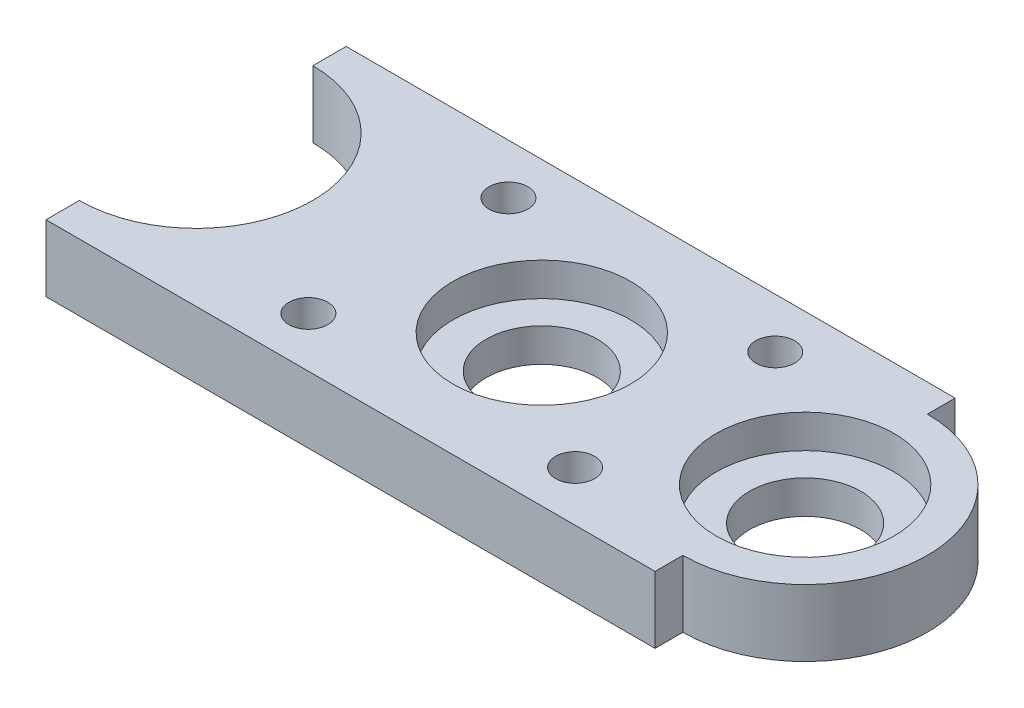
ISO-10303-21;
HEADER;
FILE_DESCRIPTION(('STEP AP214'),'2;1');
FILE_NAME('part.step','',(''),(''),'','','');
FILE_SCHEMA(('AUTOMOTIVE_DESIGN { 1 0 10303 214 1 1 1 1 }'));
ENDSEC;
DATA;
#1=APPLICATION_CONTEXT('core data for automotive mechanical design processes');
#2=APPLICATION_PROTOCOL_DEFINITION('international standard','automotive_design',2000,#1);
#3=PRODUCT_CONTEXT('',#1,'mechanical');
#4=PRODUCT('Part','Part','',(#3));
#5=PRODUCT_RELATED_PRODUCT_CATEGORY('part','',(#4));
#6=PRODUCT_DEFINITION_FORMATION('','',#4);
#7=PRODUCT_DEFINITION_CONTEXT('part definition',#1,'design');
#8=PRODUCT_DEFINITION('design','',#6,#7);
#9=PRODUCT_DEFINITION_SHAPE('','',#8);
#10=(LENGTH_UNIT() NAMED_UNIT(*) SI_UNIT(.MILLI.,.METRE.));
#11=(NAMED_UNIT(*) PLANE_ANGLE_UNIT() SI_UNIT($,.RADIAN.));
#12=(NAMED_UNIT(*) SI_UNIT($,.STERADIAN.) SOLID_ANGLE_UNIT());
#13=UNCERTAINTY_MEASURE_WITH_UNIT(LENGTH_MEASURE(1.E-05),#10,'distance_accuracy_value','');
#14=(GEOMETRIC_REPRESENTATION_CONTEXT(3) GLOBAL_UNCERTAINTY_ASSIGNED_CONTEXT((#13)) GLOBAL_UNIT_ASSIGNED_CONTEXT((#10,
#11,#12)) REPRESENTATION_CONTEXT('',''));
#15=CARTESIAN_POINT('',(0.,0.,0.));
#16=DIRECTION('',(0.,0.,1.));
#17=DIRECTION('',(1.,0.,0.));
#18=AXIS2_PLACEMENT_3D('',#15,#16,#17);
#19=CARTESIAN_POINT('',(0.,6.,0.));
#20=DIRECTION('',(0.,-1.,0.));
#21=DIRECTION('',(0.,0.,-1.));
#22=AXIS2_PLACEMENT_3D('',#19,#20,#21);
#23=CYLINDRICAL_SURFACE('',#22,5.);
#24=CARTESIAN_POINT('',(0.,0.,0.));
#25=DIRECTION('',(0.,1.,0.));
#26=DIRECTION('',(0.,0.,1.));
#27=AXIS2_PLACEMENT_3D('',#24,#25,#26);
#28=CIRCLE('',#27,5.);
#29=CARTESIAN_POINT('',(0.,0.,5.));
#30=VERTEX_POINT('',#29);
#31=EDGE_CURVE('E139',#30,#30,#28,.T.);
#32=ORIENTED_EDGE('',*,*,#31,.F.);
#33=EDGE_LOOP('',(#32));
#34=FACE_BOUND('',#33,.T.);
#35=CARTESIAN_POINT('',(0.,3.,0.));
#36=DIRECTION('',(0.,1.,0.));
#37=DIRECTION('',(0.,0.,1.));
#38=AXIS2_PLACEMENT_3D('',#35,#36,#37);
#39=CIRCLE('',#38,5.);
#40=CARTESIAN_POINT('',(0.,3.,5.));
#41=VERTEX_POINT('',#40);
#42=EDGE_CURVE('E490',#41,#41,#39,.T.);
#43=ORIENTED_EDGE('',*,*,#42,.T.);
#44=EDGE_LOOP('',(#43));
#45=FACE_BOUND('',#44,.T.);
#46=ADVANCED_FACE('F39',(#34,#45),#23,.F.);
#47=CARTESIAN_POINT('',(23.69,6.,0.));
#48=DIRECTION('',(0.,-1.,0.));
#49=DIRECTION('',(0.,0.,-1.));
#50=AXIS2_PLACEMENT_3D('',#47,#48,#49);
#51=CYLINDRICAL_SURFACE('',#50,5.);
#52=CARTESIAN_POINT('',(23.69,0.,0.));
#53=DIRECTION('',(0.,1.,0.));
#54=DIRECTION('',(0.,0.,1.));
#55=AXIS2_PLACEMENT_3D('',#52,#53,#54);
#56=CIRCLE('',#55,5.);
#57=CARTESIAN_POINT('',(23.69,0.,5.));
#58=VERTEX_POINT('',#57);
#59=EDGE_CURVE('E136',#58,#58,#56,.T.);
#60=ORIENTED_EDGE('',*,*,#59,.F.);
#61=EDGE_LOOP('',(#60));
#62=FACE_BOUND('',#61,.T.);
#63=CARTESIAN_POINT('',(23.69,3.,0.));
#64=DIRECTION('',(0.,1.,0.));
#65=DIRECTION('',(0.,0.,1.));
#66=AXIS2_PLACEMENT_3D('',#63,#64,#65);
#67=CIRCLE('',#66,5.);
#68=CARTESIAN_POINT('',(23.69,3.,5.));
#69=VERTEX_POINT('',#68);
#70=EDGE_CURVE('E499',#69,#69,#67,.T.);
#71=ORIENTED_EDGE('',*,*,#70,.T.);
#72=EDGE_LOOP('',(#71));
#73=FACE_BOUND('',#72,.T.);
#74=ADVANCED_FACE('F41',(#62,#73),#51,.F.);
#75=CARTESIAN_POINT('',(12.,6.,-9.));
#76=DIRECTION('',(0.,-1.,0.));
#77=DIRECTION('',(0.,0.,-1.));
#78=AXIS2_PLACEMENT_3D('',#75,#76,#77);
#79=CYLINDRICAL_SURFACE('',#78,1.75);
#80=CARTESIAN_POINT('',(12.,6.,-9.));
#81=DIRECTION('',(0.,1.,0.));
#82=DIRECTION('',(0.,0.,1.));
#83=AXIS2_PLACEMENT_3D('',#80,#81,#82);
#84=CIRCLE('',#83,1.75);
#85=CARTESIAN_POINT('',(12.,6.,-7.25));
#86=VERTEX_POINT('',#85);
#87=EDGE_CURVE('E265',#86,#86,#84,.T.);
#88=ORIENTED_EDGE('',*,*,#87,.T.);
#89=EDGE_LOOP('',(#88));
#90=FACE_BOUND('',#89,.T.);
#91=CARTESIAN_POINT('',(12.,3.,-9.));
#92=DIRECTION('',(0.,-1.,0.));
#93=DIRECTION('',(0.,0.,-1.));
#94=AXIS2_PLACEMENT_3D('',#91,#92,#93);
#95=CIRCLE('',#94,1.75);
#96=CARTESIAN_POINT('',(12.,3.,-10.75));
#97=VERTEX_POINT('',#96);
#98=EDGE_CURVE('E242',#97,#97,#95,.T.);
#99=ORIENTED_EDGE('',*,*,#98,.T.);
#100=EDGE_LOOP('',(#99));
#101=FACE_BOUND('',#100,.T.);
#102=ADVANCED_FACE('F199',(#90,#101),#79,.F.);
#103=CARTESIAN_POINT('',(12.,6.,9.));
#104=DIRECTION('',(0.,-1.,0.));
#105=DIRECTION('',(0.,0.,-1.));
#106=AXIS2_PLACEMENT_3D('',#103,#104,#105);
#107=CYLINDRICAL_SURFACE('',#106,1.75);
#108=CARTESIAN_POINT('',(12.,6.,9.));
#109=DIRECTION('',(0.,1.,0.));
#110=DIRECTION('',(0.,0.,1.));
#111=AXIS2_PLACEMENT_3D('',#108,#109,#110);
#112=CIRCLE('',#111,1.75);
#113=CARTESIAN_POINT('',(12.,6.,10.75));
#114=VERTEX_POINT('',#113);
#115=EDGE_CURVE('E262',#114,#114,#112,.T.);
#116=ORIENTED_EDGE('',*,*,#115,.T.);
#117=EDGE_LOOP('',(#116));
#118=FACE_BOUND('',#117,.T.);
#119=CARTESIAN_POINT('',(12.,3.,9.));
#120=DIRECTION('',(0.,-1.,0.));
#121=DIRECTION('',(0.,0.,-1.));
#122=AXIS2_PLACEMENT_3D('',#119,#120,#121);
#123=CIRCLE('',#122,1.75);
#124=CARTESIAN_POINT('',(12.,3.,7.25));
#125=VERTEX_POINT('',#124);
#126=EDGE_CURVE('E236',#125,#125,#123,.T.);
#127=ORIENTED_EDGE('',*,*,#126,.T.);
#128=EDGE_LOOP('',(#127));
#129=FACE_BOUND('',#128,.T.);
#130=ADVANCED_FACE('F204',(#118,#129),#107,.F.);
#131=CARTESIAN_POINT('',(-12.,6.,9.));
#132=DIRECTION('',(0.,-1.,0.));
#133=DIRECTION('',(0.,0.,-1.));
#134=AXIS2_PLACEMENT_3D('',#131,#132,#133);
#135=CYLINDRICAL_SURFACE('',#134,1.75);
#136=CARTESIAN_POINT('',(-12.,6.,9.));
#137=DIRECTION('',(0.,1.,0.));
#138=DIRECTION('',(0.,0.,1.));
#139=AXIS2_PLACEMENT_3D('',#136,#137,#138);
#140=CIRCLE('',#139,1.75);
#141=CARTESIAN_POINT('',(-12.,6.,10.75));
#142=VERTEX_POINT('',#141);
#143=EDGE_CURVE('E215',#142,#142,#140,.T.);
#144=ORIENTED_EDGE('',*,*,#143,.T.);
#145=EDGE_LOOP('',(#144));
#146=FACE_BOUND('',#145,.T.);
#147=CARTESIAN_POINT('',(-12.,3.,9.));
#148=DIRECTION('',(0.,-1.,0.));
#149=DIRECTION('',(0.,0.,-1.));
#150=AXIS2_PLACEMENT_3D('',#147,#148,#149);
#151=CIRCLE('',#150,1.75);
#152=CARTESIAN_POINT('',(-12.,3.,7.25));
#153=VERTEX_POINT('',#152);
#154=EDGE_CURVE('E218',#153,#153,#151,.T.);
#155=ORIENTED_EDGE('',*,*,#154,.T.);
#156=EDGE_LOOP('',(#155));
#157=FACE_BOUND('',#156,.T.);
#158=ADVANCED_FACE('F189',(#146,#157),#135,.F.);
#159=CARTESIAN_POINT('',(-12.,6.,-9.));
#160=DIRECTION('',(0.,-1.,0.));
#161=DIRECTION('',(0.,0.,-1.));
#162=AXIS2_PLACEMENT_3D('',#159,#160,#161);
#163=CYLINDRICAL_SURFACE('',#162,1.75);
#164=CARTESIAN_POINT('',(-12.,6.,-9.));
#165=DIRECTION('',(0.,1.,0.));
#166=DIRECTION('',(0.,0.,1.));
#167=AXIS2_PLACEMENT_3D('',#164,#165,#166);
#168=CIRCLE('',#167,1.75);
#169=CARTESIAN_POINT('',(-12.,6.,-7.25));
#170=VERTEX_POINT('',#169);
#171=EDGE_CURVE('E258',#170,#170,#168,.T.);
#172=ORIENTED_EDGE('',*,*,#171,.T.);
#173=EDGE_LOOP('',(#172));
#174=FACE_BOUND('',#173,.T.);
#175=CARTESIAN_POINT('',(-12.,3.,-9.));
#176=DIRECTION('',(0.,-1.,0.));
#177=DIRECTION('',(0.,0.,-1.));
#178=AXIS2_PLACEMENT_3D('',#175,#176,#177);
#179=CIRCLE('',#178,1.75);
#180=CARTESIAN_POINT('',(-12.,3.,-10.75));
#181=VERTEX_POINT('',#180);
#182=EDGE_CURVE('E234',#181,#181,#179,.T.);
#183=ORIENTED_EDGE('',*,*,#182,.T.);
#184=EDGE_LOOP('',(#183));
#185=FACE_BOUND('',#184,.T.);
#186=ADVANCED_FACE('F181',(#174,#185),#163,.F.);
#187=CARTESIAN_POINT('',(-31.1,6.,0.));
#188=DIRECTION('',(0.,-1.,0.));
#189=DIRECTION('',(0.,0.,-1.));
#190=AXIS2_PLACEMENT_3D('',#187,#188,#189);
#191=CYLINDRICAL_SURFACE('',#190,10.5);
#192=CARTESIAN_POINT('',(-31.1,0.,0.));
#193=DIRECTION('',(0.,1.,0.));
#194=DIRECTION('',(0.,0.,1.));
#195=AXIS2_PLACEMENT_3D('',#192,#193,#194);
#196=CIRCLE('',#195,10.5);
#197=CARTESIAN_POINT('',(-31.1,0.,10.5));
#198=VERTEX_POINT('',#197);
#199=CARTESIAN_POINT('',(-31.1,0.,-10.5));
#200=VERTEX_POINT('',#199);
#201=EDGE_CURVE('E143',#198,#200,#196,.T.);
#202=ORIENTED_EDGE('',*,*,#201,.F.);
#203=DIRECTION('',(0.,-1.,0.));
#204=VECTOR('',#203,1.);
#205=CARTESIAN_POINT('',(-31.1,6.,10.5));
#206=LINE('',#205,#204);
#207=CARTESIAN_POINT('',(-31.1,6.,10.5));
#208=VERTEX_POINT('',#207);
#209=EDGE_CURVE('E11',#208,#198,#206,.T.);
#210=ORIENTED_EDGE('',*,*,#209,.F.);
#211=CARTESIAN_POINT('',(-31.1,6.,0.));
#212=DIRECTION('',(0.,1.,0.));
#213=DIRECTION('',(0.,0.,1.));
#214=AXIS2_PLACEMENT_3D('',#211,#212,#213);
#215=CIRCLE('',#214,10.5);
#216=CARTESIAN_POINT('',(-31.1,6.,-10.5));
#217=VERTEX_POINT('',#216);
#218=EDGE_CURVE('E268',#208,#217,#215,.T.);
#219=ORIENTED_EDGE('',*,*,#218,.T.);
#220=DIRECTION('',(0.,-1.,0.));
#221=VECTOR('',#220,1.);
#222=CARTESIAN_POINT('',(-31.1,6.,-10.5));
#223=LINE('',#222,#221);
#224=EDGE_CURVE('E90',#217,#200,#223,.T.);
#225=ORIENTED_EDGE('',*,*,#224,.T.);
#226=EDGE_LOOP('',(#202,#210,#219,#225));
#227=FACE_BOUND('',#226,.T.);
#228=ADVANCED_FACE('F179',(#227),#191,.F.);
#229=CARTESIAN_POINT('',(-31.1,6.,0.));
#230=DIRECTION('',(1.,0.,0.));
#231=DIRECTION('',(0.,0.,-1.));
#232=AXIS2_PLACEMENT_3D('',#229,#230,#231);
#233=PLANE('',#232);
#234=DIRECTION('',(0.,0.,1.));
#235=VECTOR('',#234,1.);
#236=CARTESIAN_POINT('',(-31.1,0.,0.));
#237=LINE('',#236,#235);
#238=CARTESIAN_POINT('',(-31.1,0.,13.5));
#239=VERTEX_POINT('',#238);
#240=EDGE_CURVE('E146',#198,#239,#237,.T.);
#241=ORIENTED_EDGE('',*,*,#240,.T.);
#242=DIRECTION('',(0.,-1.,0.));
#243=VECTOR('',#242,1.);
#244=CARTESIAN_POINT('',(-31.1,6.,13.5));
#245=LINE('',#244,#243);
#246=CARTESIAN_POINT('',(-31.1,6.,13.5));
#247=VERTEX_POINT('',#246);
#248=EDGE_CURVE('E48',#247,#239,#245,.T.);
#249=ORIENTED_EDGE('',*,*,#248,.F.);
#250=DIRECTION('',(0.,0.,1.));
#251=VECTOR('',#250,1.);
#252=CARTESIAN_POINT('',(-31.1,6.,0.));
#253=LINE('',#252,#251);
#254=EDGE_CURVE('E133',#208,#247,#253,.T.);
#255=ORIENTED_EDGE('',*,*,#254,.F.);
#256=ORIENTED_EDGE('',*,*,#209,.T.);
#257=EDGE_LOOP('',(#241,#249,#255,#256));
#258=FACE_BOUND('',#257,.T.);
#259=ADVANCED_FACE('F176',(#258),#233,.F.);
#260=CARTESIAN_POINT('',(0.,6.,13.5));
#261=DIRECTION('',(0.,0.,-1.));
#262=DIRECTION('',(-1.,0.,0.));
#263=AXIS2_PLACEMENT_3D('',#260,#261,#262);
#264=PLANE('',#263);
#265=DIRECTION('',(1.,0.,0.));
#266=VECTOR('',#265,1.);
#267=CARTESIAN_POINT('',(0.,0.,13.5));
#268=LINE('',#267,#266);
#269=CARTESIAN_POINT('',(23.69,0.,13.5));
#270=VERTEX_POINT('',#269);
#271=EDGE_CURVE('E149',#239,#270,#268,.T.);
#272=ORIENTED_EDGE('',*,*,#271,.T.);
#273=DIRECTION('',(0.,-1.,0.));
#274=VECTOR('',#273,1.);
#275=CARTESIAN_POINT('',(23.69,6.,13.5));
#276=LINE('',#275,#274);
#277=CARTESIAN_POINT('',(23.69,6.,13.5));
#278=VERTEX_POINT('',#277);
#279=EDGE_CURVE('E166',#278,#270,#276,.T.);
#280=ORIENTED_EDGE('',*,*,#279,.F.);
#281=DIRECTION('',(1.,0.,0.));
#282=VECTOR('',#281,1.);
#283=CARTESIAN_POINT('',(0.,6.,13.5));
#284=LINE('',#283,#282);
#285=EDGE_CURVE('E172',#247,#278,#284,.T.);
#286=ORIENTED_EDGE('',*,*,#285,.F.);
#287=ORIENTED_EDGE('',*,*,#248,.T.);
#288=EDGE_LOOP('',(#272,#280,#286,#287));
#289=FACE_BOUND('',#288,.T.);
#290=ADVANCED_FACE('F170',(#289),#264,.F.);
#291=CARTESIAN_POINT('',(23.69,6.,0.));
#292=DIRECTION('',(1.,0.,0.));
#293=DIRECTION('',(0.,0.,-1.));
#294=AXIS2_PLACEMENT_3D('',#291,#292,#293);
#295=PLANE('',#294);
#296=DIRECTION('',(0.,0.,1.));
#297=VECTOR('',#296,1.);
#298=CARTESIAN_POINT('',(23.69,0.,0.));
#299=LINE('',#298,#297);
#300=CARTESIAN_POINT('',(23.69,0.,11.));
#301=VERTEX_POINT('',#300);
#302=EDGE_CURVE('E153',#301,#270,#299,.T.);
#303=ORIENTED_EDGE('',*,*,#302,.F.);
#304=DIRECTION('',(0.,-1.,0.));
#305=VECTOR('',#304,1.);
#306=CARTESIAN_POINT('',(23.69,6.,11.));
#307=LINE('',#306,#305);
#308=CARTESIAN_POINT('',(23.69,6.,11.));
#309=VERTEX_POINT('',#308);
#310=EDGE_CURVE('E164',#309,#301,#307,.T.);
#311=ORIENTED_EDGE('',*,*,#310,.F.);
#312=DIRECTION('',(0.,0.,1.));
#313=VECTOR('',#312,1.);
#314=CARTESIAN_POINT('',(23.69,6.,0.));
#315=LINE('',#314,#313);
#316=EDGE_CURVE('E129',#309,#278,#315,.T.);
#317=ORIENTED_EDGE('',*,*,#316,.T.);
#318=ORIENTED_EDGE('',*,*,#279,.T.);
#319=EDGE_LOOP('',(#303,#311,#317,#318));
#320=FACE_BOUND('',#319,.T.);
#321=ADVANCED_FACE('F273',(#320),#295,.T.);
#322=CARTESIAN_POINT('',(23.69,6.,0.));
#323=DIRECTION('',(0.,-1.,0.));
#324=DIRECTION('',(0.,0.,-1.));
#325=AXIS2_PLACEMENT_3D('',#322,#323,#324);
#326=CYLINDRICAL_SURFACE('',#325,11.);
#327=CARTESIAN_POINT('',(23.69,0.,0.));
#328=DIRECTION('',(0.,1.,0.));
#329=DIRECTION('',(0.,0.,1.));
#330=AXIS2_PLACEMENT_3D('',#327,#328,#329);
#331=CIRCLE('',#330,11.);
#332=CARTESIAN_POINT('',(23.69,0.,-11.));
#333=VERTEX_POINT('',#332);
#334=EDGE_CURVE('E156',#301,#333,#331,.T.);
#335=ORIENTED_EDGE('',*,*,#334,.T.);
#336=DIRECTION('',(0.,-1.,0.));
#337=VECTOR('',#336,1.);
#338=CARTESIAN_POINT('',(23.69,6.,-11.));
#339=LINE('',#338,#337);
#340=CARTESIAN_POINT('',(23.69,6.,-11.));
#341=VERTEX_POINT('',#340);
#342=EDGE_CURVE('E120',#341,#333,#339,.T.);
#343=ORIENTED_EDGE('',*,*,#342,.F.);
#344=CARTESIAN_POINT('',(23.69,6.,0.));
#345=DIRECTION('',(0.,1.,0.));
#346=DIRECTION('',(0.,0.,1.));
#347=AXIS2_PLACEMENT_3D('',#344,#345,#346);
#348=CIRCLE('',#347,11.);
#349=EDGE_CURVE('E126',#309,#341,#348,.T.);
#350=ORIENTED_EDGE('',*,*,#349,.F.);
#351=ORIENTED_EDGE('',*,*,#310,.T.);
#352=EDGE_LOOP('',(#335,#343,#350,#351));
#353=FACE_BOUND('',#352,.T.);
#354=ADVANCED_FACE('F276',(#353),#326,.T.);
#355=CARTESIAN_POINT('',(23.69,0.,-13.5));
#356=VERTEX_POINT('',#355);
#357=EDGE_CURVE('E115',#356,#333,#299,.T.);
#358=ORIENTED_EDGE('',*,*,#357,.F.);
#359=DIRECTION('',(0.,-1.,0.));
#360=VECTOR('',#359,1.);
#361=CARTESIAN_POINT('',(23.69,6.,-13.5));
#362=LINE('',#361,#360);
#363=CARTESIAN_POINT('',(23.69,6.,-13.5));
#364=VERTEX_POINT('',#363);
#365=EDGE_CURVE('E110',#364,#356,#362,.T.);
#366=ORIENTED_EDGE('',*,*,#365,.F.);
#367=EDGE_CURVE('E113',#364,#341,#315,.T.);
#368=ORIENTED_EDGE('',*,*,#367,.T.);
#369=ORIENTED_EDGE('',*,*,#342,.T.);
#370=EDGE_LOOP('',(#358,#366,#368,#369));
#371=FACE_BOUND('',#370,.T.);
#372=ADVANCED_FACE('F112',(#371),#295,.T.);
#373=CARTESIAN_POINT('',(0.,6.,-13.5));
#374=DIRECTION('',(0.,0.,-1.));
#375=DIRECTION('',(-1.,0.,0.));
#376=AXIS2_PLACEMENT_3D('',#373,#374,#375);
#377=PLANE('',#376);
#378=DIRECTION('',(1.,0.,0.));
#379=VECTOR('',#378,1.);
#380=CARTESIAN_POINT('',(0.,0.,-13.5));
#381=LINE('',#380,#379);
#382=CARTESIAN_POINT('',(-31.1,0.,-13.5));
#383=VERTEX_POINT('',#382);
#384=EDGE_CURVE('E159',#383,#356,#381,.T.);
#385=ORIENTED_EDGE('',*,*,#384,.F.);
#386=DIRECTION('',(0.,-1.,0.));
#387=VECTOR('',#386,1.);
#388=CARTESIAN_POINT('',(-31.1,6.,-13.5));
#389=LINE('',#388,#387);
#390=CARTESIAN_POINT('',(-31.1,6.,-13.5));
#391=VERTEX_POINT('',#390);
#392=EDGE_CURVE('E83',#391,#383,#389,.T.);
#393=ORIENTED_EDGE('',*,*,#392,.F.);
#394=DIRECTION('',(1.,0.,0.));
#395=VECTOR('',#394,1.);
#396=CARTESIAN_POINT('',(0.,6.,-13.5));
#397=LINE('',#396,#395);
#398=EDGE_CURVE('E123',#391,#364,#397,.T.);
#399=ORIENTED_EDGE('',*,*,#398,.T.);
#400=ORIENTED_EDGE('',*,*,#365,.T.);
#401=EDGE_LOOP('',(#385,#393,#399,#400));
#402=FACE_BOUND('',#401,.T.);
#403=ADVANCED_FACE('F130',(#402),#377,.T.);
#404=EDGE_CURVE('E150',#383,#200,#237,.T.);
#405=ORIENTED_EDGE('',*,*,#404,.T.);
#406=ORIENTED_EDGE('',*,*,#224,.F.);
#407=EDGE_CURVE('E56',#391,#217,#253,.T.);
#408=ORIENTED_EDGE('',*,*,#407,.F.);
#409=ORIENTED_EDGE('',*,*,#392,.T.);
#410=EDGE_LOOP('',(#405,#406,#408,#409));
#411=FACE_BOUND('',#410,.T.);
#412=ADVANCED_FACE('F188',(#411),#233,.F.);
#413=CARTESIAN_POINT('',(0.,6.,0.));
#414=DIRECTION('',(0.,1.,0.));
#415=DIRECTION('',(0.,0.,1.));
#416=AXIS2_PLACEMENT_3D('',#413,#414,#415);
#417=PLANE('',#416);
#418=CARTESIAN_POINT('',(0.,6.,0.));
#419=DIRECTION('',(0.,1.,0.));
#420=DIRECTION('',(0.,0.,1.));
#421=AXIS2_PLACEMENT_3D('',#418,#419,#420);
#422=CIRCLE('',#421,8.);
#423=CARTESIAN_POINT('',(0.,6.,8.));
#424=VERTEX_POINT('',#423);
#425=EDGE_CURVE('E493',#424,#424,#422,.T.);
#426=ORIENTED_EDGE('',*,*,#425,.F.);
#427=EDGE_LOOP('',(#426));
#428=FACE_BOUND('',#427,.T.);
#429=CARTESIAN_POINT('',(23.69,6.,0.));
#430=DIRECTION('',(0.,1.,0.));
#431=DIRECTION('',(0.,0.,1.));
#432=AXIS2_PLACEMENT_3D('',#429,#430,#431);
#433=CIRCLE('',#432,8.);
#434=CARTESIAN_POINT('',(23.69,6.,8.));
#435=VERTEX_POINT('',#434);
#436=EDGE_CURVE('E231',#435,#435,#433,.T.);
#437=ORIENTED_EDGE('',*,*,#436,.F.);
#438=EDGE_LOOP('',(#437));
#439=FACE_BOUND('',#438,.T.);
#440=ORIENTED_EDGE('',*,*,#171,.F.);
#441=EDGE_LOOP('',(#440));
#442=FACE_BOUND('',#441,.T.);
#443=ORIENTED_EDGE('',*,*,#143,.F.);
#444=EDGE_LOOP('',(#443));
#445=FACE_BOUND('',#444,.T.);
#446=ORIENTED_EDGE('',*,*,#115,.F.);
#447=EDGE_LOOP('',(#446));
#448=FACE_BOUND('',#447,.T.);
#449=ORIENTED_EDGE('',*,*,#87,.F.);
#450=EDGE_LOOP('',(#449));
#451=FACE_BOUND('',#450,.T.);
#452=ORIENTED_EDGE('',*,*,#218,.F.);
#453=ORIENTED_EDGE('',*,*,#254,.T.);
#454=ORIENTED_EDGE('',*,*,#285,.T.);
#455=ORIENTED_EDGE('',*,*,#316,.F.);
#456=ORIENTED_EDGE('',*,*,#349,.T.);
#457=ORIENTED_EDGE('',*,*,#367,.F.);
#458=ORIENTED_EDGE('',*,*,#398,.F.);
#459=ORIENTED_EDGE('',*,*,#407,.T.);
#460=EDGE_LOOP('',(#452,#453,#454,#455,#456,#457,#458,#459));
#461=FACE_BOUND('',#460,.T.);
#462=ADVANCED_FACE('F122',(#428,#439,#442,#445,#448,#451,#461),#417,.T.);
#463=CARTESIAN_POINT('',(0.,0.,0.));
#464=DIRECTION('',(0.,1.,0.));
#465=DIRECTION('',(0.,0.,1.));
#466=AXIS2_PLACEMENT_3D('',#463,#464,#465);
#467=PLANE('',#466);
#468=CARTESIAN_POINT('',(12.,0.,-9.));
#469=DIRECTION('',(0.,-1.,0.));
#470=DIRECTION('',(0.,0.,-1.));
#471=AXIS2_PLACEMENT_3D('',#468,#469,#470);
#472=CIRCLE('',#471,3.);
#473=CARTESIAN_POINT('',(12.,0.,-12.));
#474=VERTEX_POINT('',#473);
#475=EDGE_CURVE('E245',#474,#474,#472,.T.);
#476=ORIENTED_EDGE('',*,*,#475,.F.);
#477=EDGE_LOOP('',(#476));
#478=FACE_BOUND('',#477,.T.);
#479=CARTESIAN_POINT('',(12.,0.,9.));
#480=DIRECTION('',(0.,-1.,0.));
#481=DIRECTION('',(0.,0.,-1.));
#482=AXIS2_PLACEMENT_3D('',#479,#480,#481);
#483=CIRCLE('',#482,3.);
#484=CARTESIAN_POINT('',(12.,0.,6.));
#485=VERTEX_POINT('',#484);
#486=EDGE_CURVE('E227',#485,#485,#483,.T.);
#487=ORIENTED_EDGE('',*,*,#486,.F.);
#488=EDGE_LOOP('',(#487));
#489=FACE_BOUND('',#488,.T.);
#490=CARTESIAN_POINT('',(-12.,0.,9.));
#491=DIRECTION('',(0.,-1.,0.));
#492=DIRECTION('',(0.,0.,-1.));
#493=AXIS2_PLACEMENT_3D('',#490,#491,#492);
#494=CIRCLE('',#493,3.);
#495=CARTESIAN_POINT('',(-12.,0.,6.));
#496=VERTEX_POINT('',#495);
#497=EDGE_CURVE('E220',#496,#496,#494,.T.);
#498=ORIENTED_EDGE('',*,*,#497,.F.);
#499=EDGE_LOOP('',(#498));
#500=FACE_BOUND('',#499,.T.);
#501=CARTESIAN_POINT('',(-12.,0.,-9.));
#502=DIRECTION('',(0.,-1.,0.));
#503=DIRECTION('',(0.,0.,-1.));
#504=AXIS2_PLACEMENT_3D('',#501,#502,#503);
#505=CIRCLE('',#504,3.);
#506=CARTESIAN_POINT('',(-12.,0.,-12.));
#507=VERTEX_POINT('',#506);
#508=EDGE_CURVE('E253',#507,#507,#505,.T.);
#509=ORIENTED_EDGE('',*,*,#508,.F.);
#510=EDGE_LOOP('',(#509));
#511=FACE_BOUND('',#510,.T.);
#512=ORIENTED_EDGE('',*,*,#59,.T.);
#513=EDGE_LOOP('',(#512));
#514=FACE_BOUND('',#513,.T.);
#515=ORIENTED_EDGE('',*,*,#31,.T.);
#516=EDGE_LOOP('',(#515));
#517=FACE_BOUND('',#516,.T.);
#518=ORIENTED_EDGE('',*,*,#201,.T.);
#519=ORIENTED_EDGE('',*,*,#404,.F.);
#520=ORIENTED_EDGE('',*,*,#384,.T.);
#521=ORIENTED_EDGE('',*,*,#357,.T.);
#522=ORIENTED_EDGE('',*,*,#334,.F.);
#523=ORIENTED_EDGE('',*,*,#302,.T.);
#524=ORIENTED_EDGE('',*,*,#271,.F.);
#525=ORIENTED_EDGE('',*,*,#240,.F.);
#526=EDGE_LOOP('',(#518,#519,#520,#521,#522,#523,#524,#525));
#527=FACE_BOUND('',#526,.T.);
#528=ADVANCED_FACE('F178',(#478,#489,#500,#511,#514,#517,#527),#467,.F.);
#529=CARTESIAN_POINT('',(-12.,3.,-9.));
#530=DIRECTION('',(0.,-1.,0.));
#531=DIRECTION('',(0.,0.,-1.));
#532=AXIS2_PLACEMENT_3D('',#529,#530,#531);
#533=CYLINDRICAL_SURFACE('',#532,3.);
#534=CARTESIAN_POINT('',(-12.,3.,-9.));
#535=DIRECTION('',(0.,-1.,0.));
#536=DIRECTION('',(0.,0.,-1.));
#537=AXIS2_PLACEMENT_3D('',#534,#535,#536);
#538=CIRCLE('',#537,3.);
#539=CARTESIAN_POINT('',(-12.,3.,-12.));
#540=VERTEX_POINT('',#539);
#541=EDGE_CURVE('E140',#540,#540,#538,.T.);
#542=ORIENTED_EDGE('',*,*,#541,.F.);
#543=EDGE_LOOP('',(#542));
#544=FACE_BOUND('',#543,.T.);
#545=ORIENTED_EDGE('',*,*,#508,.T.);
#546=EDGE_LOOP('',(#545));
#547=FACE_BOUND('',#546,.T.);
#548=ADVANCED_FACE('F347',(#544,#547),#533,.F.);
#549=CARTESIAN_POINT('',(-12.,3.,-9.));
#550=DIRECTION('',(0.,-1.,0.));
#551=DIRECTION('',(0.,0.,-1.));
#552=AXIS2_PLACEMENT_3D('',#549,#550,#551);
#553=PLANE('',#552);
#554=ORIENTED_EDGE('',*,*,#182,.F.);
#555=EDGE_LOOP('',(#554));
#556=FACE_BOUND('',#555,.T.);
#557=ORIENTED_EDGE('',*,*,#541,.T.);
#558=EDGE_LOOP('',(#557));
#559=FACE_BOUND('',#558,.T.);
#560=ADVANCED_FACE('F356',(#556,#559),#553,.T.);
#561=CARTESIAN_POINT('',(-12.,3.,9.));
#562=DIRECTION('',(0.,-1.,0.));
#563=DIRECTION('',(0.,0.,-1.));
#564=AXIS2_PLACEMENT_3D('',#561,#562,#563);
#565=CYLINDRICAL_SURFACE('',#564,3.);
#566=CARTESIAN_POINT('',(-12.,3.,9.));
#567=DIRECTION('',(0.,-1.,0.));
#568=DIRECTION('',(0.,0.,-1.));
#569=AXIS2_PLACEMENT_3D('',#566,#567,#568);
#570=CIRCLE('',#569,3.);
#571=CARTESIAN_POINT('',(-12.,3.,6.));
#572=VERTEX_POINT('',#571);
#573=EDGE_CURVE('E224',#572,#572,#570,.T.);
#574=ORIENTED_EDGE('',*,*,#573,.F.);
#575=EDGE_LOOP('',(#574));
#576=FACE_BOUND('',#575,.T.);
#577=ORIENTED_EDGE('',*,*,#497,.T.);
#578=EDGE_LOOP('',(#577));
#579=FACE_BOUND('',#578,.T.);
#580=ADVANCED_FACE('F366',(#576,#579),#565,.F.);
#581=CARTESIAN_POINT('',(-12.,3.,9.));
#582=DIRECTION('',(0.,-1.,0.));
#583=DIRECTION('',(0.,0.,-1.));
#584=AXIS2_PLACEMENT_3D('',#581,#582,#583);
#585=PLANE('',#584);
#586=ORIENTED_EDGE('',*,*,#154,.F.);
#587=EDGE_LOOP('',(#586));
#588=FACE_BOUND('',#587,.T.);
#589=ORIENTED_EDGE('',*,*,#573,.T.);
#590=EDGE_LOOP('',(#589));
#591=FACE_BOUND('',#590,.T.);
#592=ADVANCED_FACE('F376',(#588,#591),#585,.T.);
#593=CARTESIAN_POINT('',(12.,3.,9.));
#594=DIRECTION('',(0.,-1.,0.));
#595=DIRECTION('',(0.,0.,-1.));
#596=AXIS2_PLACEMENT_3D('',#593,#594,#595);
#597=CYLINDRICAL_SURFACE('',#596,3.);
#598=CARTESIAN_POINT('',(12.,3.,9.));
#599=DIRECTION('',(0.,-1.,0.));
#600=DIRECTION('',(0.,0.,-1.));
#601=AXIS2_PLACEMENT_3D('',#598,#599,#600);
#602=CIRCLE('',#601,3.);
#603=CARTESIAN_POINT('',(12.,3.,6.));
#604=VERTEX_POINT('',#603);
#605=EDGE_CURVE('E221',#604,#604,#602,.T.);
#606=ORIENTED_EDGE('',*,*,#605,.F.);
#607=EDGE_LOOP('',(#606));
#608=FACE_BOUND('',#607,.T.);
#609=ORIENTED_EDGE('',*,*,#486,.T.);
#610=EDGE_LOOP('',(#609));
#611=FACE_BOUND('',#610,.T.);
#612=ADVANCED_FACE('F386',(#608,#611),#597,.F.);
#613=CARTESIAN_POINT('',(12.,3.,9.));
#614=DIRECTION('',(0.,-1.,0.));
#615=DIRECTION('',(0.,0.,-1.));
#616=AXIS2_PLACEMENT_3D('',#613,#614,#615);
#617=PLANE('',#616);
#618=ORIENTED_EDGE('',*,*,#126,.F.);
#619=EDGE_LOOP('',(#618));
#620=FACE_BOUND('',#619,.T.);
#621=ORIENTED_EDGE('',*,*,#605,.T.);
#622=EDGE_LOOP('',(#621));
#623=FACE_BOUND('',#622,.T.);
#624=ADVANCED_FACE('F395',(#620,#623),#617,.T.);
#625=CARTESIAN_POINT('',(12.,3.,-9.));
#626=DIRECTION('',(0.,-1.,0.));
#627=DIRECTION('',(0.,0.,-1.));
#628=AXIS2_PLACEMENT_3D('',#625,#626,#627);
#629=CYLINDRICAL_SURFACE('',#628,3.);
#630=CARTESIAN_POINT('',(12.,3.,-9.));
#631=DIRECTION('',(0.,-1.,0.));
#632=DIRECTION('',(0.,0.,-1.));
#633=AXIS2_PLACEMENT_3D('',#630,#631,#632);
#634=CIRCLE('',#633,3.);
#635=CARTESIAN_POINT('',(12.,3.,-12.));
#636=VERTEX_POINT('',#635);
#637=EDGE_CURVE('E238',#636,#636,#634,.T.);
#638=ORIENTED_EDGE('',*,*,#637,.F.);
#639=EDGE_LOOP('',(#638));
#640=FACE_BOUND('',#639,.T.);
#641=ORIENTED_EDGE('',*,*,#475,.T.);
#642=EDGE_LOOP('',(#641));
#643=FACE_BOUND('',#642,.T.);
#644=ADVANCED_FACE('F405',(#640,#643),#629,.F.);
#645=CARTESIAN_POINT('',(12.,3.,-9.));
#646=DIRECTION('',(0.,-1.,0.));
#647=DIRECTION('',(0.,0.,-1.));
#648=AXIS2_PLACEMENT_3D('',#645,#646,#647);
#649=PLANE('',#648);
#650=ORIENTED_EDGE('',*,*,#98,.F.);
#651=EDGE_LOOP('',(#650));
#652=FACE_BOUND('',#651,.T.);
#653=ORIENTED_EDGE('',*,*,#637,.T.);
#654=EDGE_LOOP('',(#653));
#655=FACE_BOUND('',#654,.T.);
#656=ADVANCED_FACE('F415',(#652,#655),#649,.T.);
#657=CARTESIAN_POINT('',(23.69,3.,0.));
#658=DIRECTION('',(0.,1.,0.));
#659=DIRECTION('',(0.,0.,1.));
#660=AXIS2_PLACEMENT_3D('',#657,#658,#659);
#661=CYLINDRICAL_SURFACE('',#660,8.);
#662=CARTESIAN_POINT('',(23.69,3.,0.));
#663=DIRECTION('',(0.,1.,0.));
#664=DIRECTION('',(0.,0.,1.));
#665=AXIS2_PLACEMENT_3D('',#662,#663,#664);
#666=CIRCLE('',#665,8.);
#667=CARTESIAN_POINT('',(23.69,3.,8.));
#668=VERTEX_POINT('',#667);
#669=EDGE_CURVE('E501',#668,#668,#666,.T.);
#670=ORIENTED_EDGE('',*,*,#669,.F.);
#671=EDGE_LOOP('',(#670));
#672=FACE_BOUND('',#671,.T.);
#673=ORIENTED_EDGE('',*,*,#436,.T.);
#674=EDGE_LOOP('',(#673));
#675=FACE_BOUND('',#674,.T.);
#676=ADVANCED_FACE('F424',(#672,#675),#661,.F.);
#677=CARTESIAN_POINT('',(23.69,3.,0.));
#678=DIRECTION('',(0.,1.,0.));
#679=DIRECTION('',(0.,0.,1.));
#680=AXIS2_PLACEMENT_3D('',#677,#678,#679);
#681=PLANE('',#680);
#682=ORIENTED_EDGE('',*,*,#70,.F.);
#683=EDGE_LOOP('',(#682));
#684=FACE_BOUND('',#683,.T.);
#685=ORIENTED_EDGE('',*,*,#669,.T.);
#686=EDGE_LOOP('',(#685));
#687=FACE_BOUND('',#686,.T.);
#688=ADVANCED_FACE('F453',(#684,#687),#681,.T.);
#689=CARTESIAN_POINT('',(0.,3.,0.));
#690=DIRECTION('',(0.,1.,0.));
#691=DIRECTION('',(0.,0.,1.));
#692=AXIS2_PLACEMENT_3D('',#689,#690,#691);
#693=CYLINDRICAL_SURFACE('',#692,8.);
#694=CARTESIAN_POINT('',(0.,3.,0.));
#695=DIRECTION('',(0.,1.,0.));
#696=DIRECTION('',(0.,0.,1.));
#697=AXIS2_PLACEMENT_3D('',#694,#695,#696);
#698=CIRCLE('',#697,8.);
#699=CARTESIAN_POINT('',(0.,3.,8.));
#700=VERTEX_POINT('',#699);
#701=EDGE_CURVE('E246',#700,#700,#698,.T.);
#702=ORIENTED_EDGE('',*,*,#701,.F.);
#703=EDGE_LOOP('',(#702));
#704=FACE_BOUND('',#703,.T.);
#705=ORIENTED_EDGE('',*,*,#425,.T.);
#706=EDGE_LOOP('',(#705));
#707=FACE_BOUND('',#706,.T.);
#708=ADVANCED_FACE('F463',(#704,#707),#693,.F.);
#709=CARTESIAN_POINT('',(0.,3.,0.));
#710=DIRECTION('',(0.,1.,0.));
#711=DIRECTION('',(0.,0.,1.));
#712=AXIS2_PLACEMENT_3D('',#709,#710,#711);
#713=PLANE('',#712);
#714=ORIENTED_EDGE('',*,*,#42,.F.);
#715=EDGE_LOOP('',(#714));
#716=FACE_BOUND('',#715,.T.);
#717=ORIENTED_EDGE('',*,*,#701,.T.);
#718=EDGE_LOOP('',(#717));
#719=FACE_BOUND('',#718,.T.);
#720=ADVANCED_FACE('F473',(#716,#719),#713,.T.);
#721=CLOSED_SHELL('',(#46,#74,#102,#130,#158,#186,#228,#259,#290,#321,#354,#372,#403,#412,#462,
#528,#548,#560,#580,#592,#612,#624,#644,#656,#676,#688,#708,#720));
#722=MANIFOLD_SOLID_BREP('B2',#721);
#723=ADVANCED_BREP_SHAPE_REPRESENTATION('',(#18,#722),#14);
#724=SHAPE_DEFINITION_REPRESENTATION(#9,#723);
ENDSEC;
END-ISO-10303-21;
